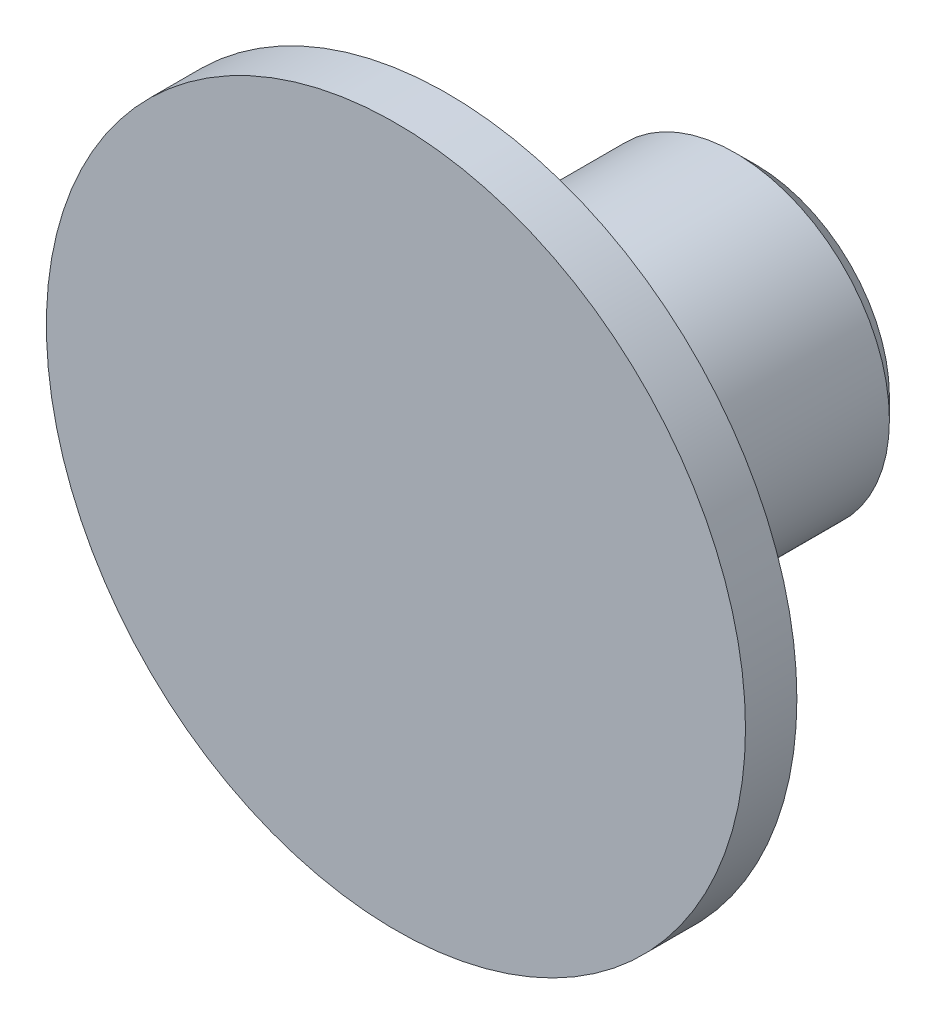
ISO-10303-21;
HEADER;
FILE_DESCRIPTION(('STEP AP214'),'2;1');
FILE_NAME('part.step','',(''),(''),'','','');
FILE_SCHEMA(('AUTOMOTIVE_DESIGN { 1 0 10303 214 1 1 1 1 }'));
ENDSEC;
DATA;
#1=APPLICATION_CONTEXT('core data for automotive mechanical design processes');
#2=APPLICATION_PROTOCOL_DEFINITION('international standard','automotive_design',2000,#1);
#3=PRODUCT_CONTEXT('',#1,'mechanical');
#4=PRODUCT('Part','Part','',(#3));
#5=PRODUCT_RELATED_PRODUCT_CATEGORY('part','',(#4));
#6=PRODUCT_DEFINITION_FORMATION('','',#4);
#7=PRODUCT_DEFINITION_CONTEXT('part definition',#1,'design');
#8=PRODUCT_DEFINITION('design','',#6,#7);
#9=PRODUCT_DEFINITION_SHAPE('','',#8);
#10=(LENGTH_UNIT() NAMED_UNIT(*) SI_UNIT(.MILLI.,.METRE.));
#11=(NAMED_UNIT(*) PLANE_ANGLE_UNIT() SI_UNIT($,.RADIAN.));
#12=(NAMED_UNIT(*) SI_UNIT($,.STERADIAN.) SOLID_ANGLE_UNIT());
#13=UNCERTAINTY_MEASURE_WITH_UNIT(LENGTH_MEASURE(1.E-05),#10,'distance_accuracy_value','');
#14=(GEOMETRIC_REPRESENTATION_CONTEXT(3) GLOBAL_UNCERTAINTY_ASSIGNED_CONTEXT((#13)) GLOBAL_UNIT_ASSIGNED_CONTEXT((#10,
#11,#12)) REPRESENTATION_CONTEXT('',''));
#15=CARTESIAN_POINT('',(0.,0.,0.));
#16=DIRECTION('',(0.,0.,1.));
#17=DIRECTION('',(1.,0.,0.));
#18=AXIS2_PLACEMENT_3D('',#15,#16,#17);
#19=CARTESIAN_POINT('',(0.,0.,30.));
#20=DIRECTION('',(0.,0.,-1.));
#21=DIRECTION('',(-1.,0.,0.));
#22=AXIS2_PLACEMENT_3D('',#19,#20,#21);
#23=CYLINDRICAL_SURFACE('',#22,15.);
#24=CARTESIAN_POINT('',(0.,0.,2.00000000000002));
#25=DIRECTION('',(0.,0.,1.));
#26=DIRECTION('',(1.,0.,0.));
#27=AXIS2_PLACEMENT_3D('',#24,#25,#26);
#28=CIRCLE('',#27,15.);
#29=CARTESIAN_POINT('',(15.,0.,2.00000000000002));
#30=VERTEX_POINT('',#29);
#31=EDGE_CURVE('E44',#30,#30,#28,.T.);
#32=ORIENTED_EDGE('',*,*,#31,.T.);
#33=EDGE_LOOP('',(#32));
#34=FACE_BOUND('',#33,.T.);
#35=CARTESIAN_POINT('',(0.,0.,30.));
#36=DIRECTION('',(0.,0.,1.));
#37=DIRECTION('',(1.,0.,0.));
#38=AXIS2_PLACEMENT_3D('',#35,#36,#37);
#39=CIRCLE('',#38,15.);
#40=CARTESIAN_POINT('',(15.,0.,30.));
#41=VERTEX_POINT('',#40);
#42=EDGE_CURVE('E48',#41,#41,#39,.T.);
#43=ORIENTED_EDGE('',*,*,#42,.F.);
#44=EDGE_LOOP('',(#43));
#45=FACE_BOUND('',#44,.T.);
#46=ADVANCED_FACE('F37',(#34,#45),#23,.T.);
#47=CARTESIAN_POINT('',(0.,0.,0.));
#48=DIRECTION('',(0.,0.,1.));
#49=DIRECTION('',(1.,0.,0.));
#50=AXIS2_PLACEMENT_3D('',#47,#48,#49);
#51=PLANE('',#50);
#52=CARTESIAN_POINT('',(0.,0.,0.));
#53=DIRECTION('',(0.,0.,1.));
#54=DIRECTION('',(1.,0.,0.));
#55=AXIS2_PLACEMENT_3D('',#52,#53,#54);
#56=CIRCLE('',#55,13.);
#57=CARTESIAN_POINT('',(13.,0.,0.));
#58=VERTEX_POINT('',#57);
#59=EDGE_CURVE('E10',#58,#58,#56,.F.);
#60=ORIENTED_EDGE('',*,*,#59,.T.);
#61=EDGE_LOOP('',(#60));
#62=FACE_BOUND('',#61,.T.);
#63=ADVANCED_FACE('F72',(#62),#51,.F.);
#64=CARTESIAN_POINT('',(0.,0.,30.));
#65=DIRECTION('',(0.,0.,1.));
#66=DIRECTION('',(1.,0.,0.));
#67=AXIS2_PLACEMENT_3D('',#64,#65,#66);
#68=PLANE('',#67);
#69=CARTESIAN_POINT('',(0.,0.,30.));
#70=DIRECTION('',(0.,0.,1.));
#71=DIRECTION('',(1.,0.,0.));
#72=AXIS2_PLACEMENT_3D('',#69,#70,#71);
#73=CIRCLE('',#72,34.);
#74=CARTESIAN_POINT('',(34.,0.,30.));
#75=VERTEX_POINT('',#74);
#76=EDGE_CURVE('E55',#75,#75,#73,.T.);
#77=ORIENTED_EDGE('',*,*,#76,.F.);
#78=EDGE_LOOP('',(#77));
#79=FACE_BOUND('',#78,.T.);
#80=ORIENTED_EDGE('',*,*,#42,.T.);
#81=EDGE_LOOP('',(#80));
#82=FACE_BOUND('',#81,.T.);
#83=ADVANCED_FACE('F66',(#79,#82),#68,.F.);
#84=CARTESIAN_POINT('',(0.,0.,35.));
#85=DIRECTION('',(0.,0.,-1.));
#86=DIRECTION('',(-1.,0.,0.));
#87=AXIS2_PLACEMENT_3D('',#84,#85,#86);
#88=CYLINDRICAL_SURFACE('',#87,34.);
#89=CARTESIAN_POINT('',(0.,0.,35.));
#90=DIRECTION('',(0.,0.,1.));
#91=DIRECTION('',(1.,0.,0.));
#92=AXIS2_PLACEMENT_3D('',#89,#90,#91);
#93=CIRCLE('',#92,34.);
#94=CARTESIAN_POINT('',(34.,0.,35.));
#95=VERTEX_POINT('',#94);
#96=EDGE_CURVE('E52',#95,#95,#93,.T.);
#97=ORIENTED_EDGE('',*,*,#96,.F.);
#98=EDGE_LOOP('',(#97));
#99=FACE_BOUND('',#98,.T.);
#100=ORIENTED_EDGE('',*,*,#76,.T.);
#101=EDGE_LOOP('',(#100));
#102=FACE_BOUND('',#101,.T.);
#103=ADVANCED_FACE('F63',(#99,#102),#88,.T.);
#104=CARTESIAN_POINT('',(0.,0.,35.));
#105=DIRECTION('',(0.,0.,1.));
#106=DIRECTION('',(1.,0.,0.));
#107=AXIS2_PLACEMENT_3D('',#104,#105,#106);
#108=PLANE('',#107);
#109=ORIENTED_EDGE('',*,*,#96,.T.);
#110=EDGE_LOOP('',(#109));
#111=FACE_BOUND('',#110,.T.);
#112=ADVANCED_FACE('F61',(#111),#108,.T.);
#113=CARTESIAN_POINT('',(0.,0.,2.00000000000002));
#114=DIRECTION('',(0.,0.,1.));
#115=DIRECTION('',(1.,0.,0.));
#116=AXIS2_PLACEMENT_3D('',#113,#114,#115);
#117=CONICAL_SURFACE('',#116,15.,0.78539816339745);
#118=ORIENTED_EDGE('',*,*,#59,.F.);
#119=EDGE_LOOP('',(#118));
#120=FACE_BOUND('',#119,.T.);
#121=ORIENTED_EDGE('',*,*,#31,.F.);
#122=EDGE_LOOP('',(#121));
#123=FACE_BOUND('',#122,.T.);
#124=ADVANCED_FACE('F39',(#120,#123),#117,.T.);
#125=CLOSED_SHELL('',(#46,#63,#83,#103,#112,#124));
#126=MANIFOLD_SOLID_BREP('B2',#125);
#127=ADVANCED_BREP_SHAPE_REPRESENTATION('',(#18,#126),#14);
#128=SHAPE_DEFINITION_REPRESENTATION(#9,#127);
ENDSEC;
END-ISO-10303-21;
